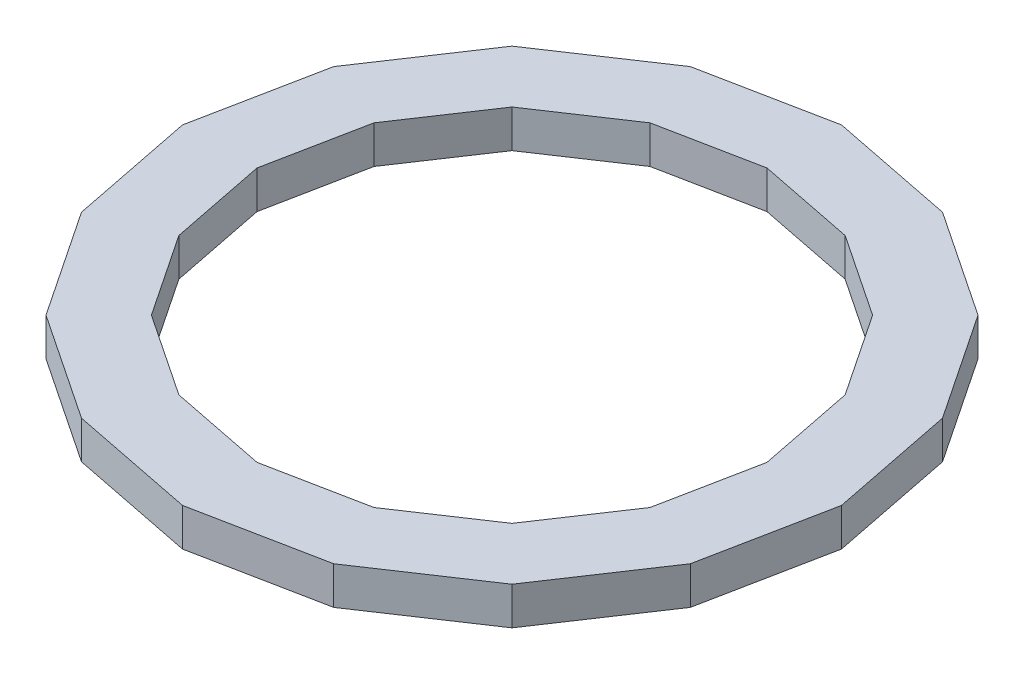
ISO-10303-21;
HEADER;
FILE_DESCRIPTION(('STEP AP214'),'2;1');
FILE_NAME('part.step','',(''),(''),'','','');
FILE_SCHEMA(('AUTOMOTIVE_DESIGN { 1 0 10303 214 1 1 1 1 }'));
ENDSEC;
DATA;
#1=APPLICATION_CONTEXT('core data for automotive mechanical design processes');
#2=APPLICATION_PROTOCOL_DEFINITION('international standard','automotive_design',2000,#1);
#3=PRODUCT_CONTEXT('',#1,'mechanical');
#4=PRODUCT('Part','Part','',(#3));
#5=PRODUCT_RELATED_PRODUCT_CATEGORY('part','',(#4));
#6=PRODUCT_DEFINITION_FORMATION('','',#4);
#7=PRODUCT_DEFINITION_CONTEXT('part definition',#1,'design');
#8=PRODUCT_DEFINITION('design','',#6,#7);
#9=PRODUCT_DEFINITION_SHAPE('','',#8);
#10=(LENGTH_UNIT() NAMED_UNIT(*) SI_UNIT(.MILLI.,.METRE.));
#11=(NAMED_UNIT(*) PLANE_ANGLE_UNIT() SI_UNIT($,.RADIAN.));
#12=(NAMED_UNIT(*) SI_UNIT($,.STERADIAN.) SOLID_ANGLE_UNIT());
#13=UNCERTAINTY_MEASURE_WITH_UNIT(LENGTH_MEASURE(1.E-05),#10,'distance_accuracy_value','');
#14=(GEOMETRIC_REPRESENTATION_CONTEXT(3) GLOBAL_UNCERTAINTY_ASSIGNED_CONTEXT((#13)) GLOBAL_UNIT_ASSIGNED_CONTEXT((#10,
#11,#12)) REPRESENTATION_CONTEXT('',''));
#15=CARTESIAN_POINT('',(0.,0.,0.));
#16=DIRECTION('',(0.,0.,1.));
#17=DIRECTION('',(1.,0.,0.));
#18=AXIS2_PLACEMENT_3D('',#15,#16,#17);
#19=CARTESIAN_POINT('',(0.,19.05,0.));
#20=DIRECTION('',(0.,1.,0.));
#21=DIRECTION('',(0.,0.,1.));
#22=AXIS2_PLACEMENT_3D('',#19,#20,#21);
#23=PLANE('',#22);
#24=DIRECTION('',(0.195090322016117,0.,-0.980785280403232));
#25=VECTOR('',#24,1.);
#26=CARTESIAN_POINT('',(153.364033393234,19.05,63.5254626117156));
#27=LINE('',#26,#25);
#28=CARTESIAN_POINT('',(153.364033393234,19.05,63.5254626117156));
#29=VERTEX_POINT('',#28);
#30=CARTESIAN_POINT('',(166.000033550218,19.05,-1.88043767974877E-12));
#31=VERTEX_POINT('',#30);
#32=EDGE_CURVE('E376',#29,#31,#27,.T.);
#33=ORIENTED_EDGE('',*,*,#32,.T.);
#34=DIRECTION('',(-0.195090322016139,0.,-0.980785280403228));
#35=VECTOR('',#34,1.);
#36=CARTESIAN_POINT('',(166.000033550218,19.05,-1.88043767974877E-12));
#37=LINE('',#36,#35);
#38=CARTESIAN_POINT('',(153.364033393232,19.05,-63.525462611719));
#39=VERTEX_POINT('',#38);
#40=EDGE_CURVE('E379',#31,#39,#37,.T.);
#41=ORIENTED_EDGE('',*,*,#40,.T.);
#42=DIRECTION('',(-0.555570233019612,0.,-0.831469612302539));
#43=VECTOR('',#42,1.);
#44=CARTESIAN_POINT('',(153.364033393232,19.05,-63.525462611719));
#45=LINE('',#44,#43);
#46=CARTESIAN_POINT('',(117.379749400552,19.05,-117.379749400555));
#47=VERTEX_POINT('',#46);
#48=EDGE_CURVE('E382',#39,#47,#45,.T.);
#49=ORIENTED_EDGE('',*,*,#48,.T.);
#50=DIRECTION('',(-0.831469612302552,0.,-0.555570233019593));
#51=VECTOR('',#50,1.);
#52=CARTESIAN_POINT('',(117.379749400552,19.05,-117.379749400555));
#53=LINE('',#52,#51);
#54=CARTESIAN_POINT('',(63.5254626117155,19.05,-153.364033393234));
#55=VERTEX_POINT('',#54);
#56=EDGE_CURVE('E384',#47,#55,#53,.T.);
#57=ORIENTED_EDGE('',*,*,#56,.T.);
#58=DIRECTION('',(-0.980785280403233,0.,-0.195090322016117));
#59=VECTOR('',#58,1.);
#60=CARTESIAN_POINT('',(63.5254626117155,19.05,-153.364033393234));
#61=LINE('',#60,#59);
#62=CARTESIAN_POINT('',(-1.84523788441443E-12,19.05,-166.000033550217));
#63=VERTEX_POINT('',#62);
#64=EDGE_CURVE('E386',#55,#63,#61,.T.);
#65=ORIENTED_EDGE('',*,*,#64,.T.);
#66=DIRECTION('',(-0.980785280403228,0.,0.195090322016139));
#67=VECTOR('',#66,1.);
#68=CARTESIAN_POINT('',(-1.84523788441443E-12,19.05,-166.000033550217));
#69=LINE('',#68,#67);
#70=CARTESIAN_POINT('',(-63.5254626117191,19.05,-153.364033393232));
#71=VERTEX_POINT('',#70);
#72=EDGE_CURVE('E388',#63,#71,#69,.T.);
#73=ORIENTED_EDGE('',*,*,#72,.T.);
#74=DIRECTION('',(-0.831469612302539,0.,0.555570233019612));
#75=VECTOR('',#74,1.);
#76=CARTESIAN_POINT('',(-63.5254626117191,19.05,-153.364033393232));
#77=LINE('',#76,#75);
#78=CARTESIAN_POINT('',(-117.379749400555,19.05,-117.379749400552));
#79=VERTEX_POINT('',#78);
#80=EDGE_CURVE('E390',#71,#79,#77,.T.);
#81=ORIENTED_EDGE('',*,*,#80,.T.);
#82=DIRECTION('',(-0.555570233019593,0.,0.831469612302552));
#83=VECTOR('',#82,1.);
#84=CARTESIAN_POINT('',(-117.379749400555,19.05,-117.379749400552));
#85=LINE('',#84,#83);
#86=CARTESIAN_POINT('',(-153.364033393234,19.05,-63.5254626117156));
#87=VERTEX_POINT('',#86);
#88=EDGE_CURVE('E392',#79,#87,#85,.T.);
#89=ORIENTED_EDGE('',*,*,#88,.T.);
#90=DIRECTION('',(-0.195090322016117,0.,0.980785280403233));
#91=VECTOR('',#90,1.);
#92=CARTESIAN_POINT('',(-153.364033393234,19.05,-63.5254626117156));
#93=LINE('',#92,#91);
#94=CARTESIAN_POINT('',(-166.000033550217,19.05,1.88176178542679E-12));
#95=VERTEX_POINT('',#94);
#96=EDGE_CURVE('E395',#87,#95,#93,.T.);
#97=ORIENTED_EDGE('',*,*,#96,.T.);
#98=DIRECTION('',(0.195090322016139,0.,0.980785280403228));
#99=VECTOR('',#98,1.);
#100=CARTESIAN_POINT('',(-166.000033550217,19.05,1.88176178542679E-12));
#101=LINE('',#100,#99);
#102=CARTESIAN_POINT('',(-153.364033393232,19.05,63.5254626117191));
#103=VERTEX_POINT('',#102);
#104=EDGE_CURVE('E397',#95,#103,#101,.T.);
#105=ORIENTED_EDGE('',*,*,#104,.T.);
#106=DIRECTION('',(0.555570233019612,0.,0.831469612302539));
#107=VECTOR('',#106,1.);
#108=CARTESIAN_POINT('',(-153.364033393232,19.05,63.5254626117191));
#109=LINE('',#108,#107);
#110=CARTESIAN_POINT('',(-117.379749400552,19.05,117.379749400555));
#111=VERTEX_POINT('',#110);
#112=EDGE_CURVE('E400',#103,#111,#109,.T.);
#113=ORIENTED_EDGE('',*,*,#112,.T.);
#114=DIRECTION('',(0.831469612302552,0.,0.555570233019593));
#115=VECTOR('',#114,1.);
#116=CARTESIAN_POINT('',(-117.379749400552,19.05,117.379749400555));
#117=LINE('',#116,#115);
#118=CARTESIAN_POINT('',(-63.5254626117156,19.05,153.364033393234));
#119=VERTEX_POINT('',#118);
#120=EDGE_CURVE('E403',#111,#119,#117,.T.);
#121=ORIENTED_EDGE('',*,*,#120,.T.);
#122=DIRECTION('',(0.980785280403233,0.,0.195090322016118));
#123=VECTOR('',#122,1.);
#124=CARTESIAN_POINT('',(-63.5254626117156,19.05,153.364033393234));
#125=LINE('',#124,#123);
#126=CARTESIAN_POINT('',(1.90230677502918E-12,19.05,166.000033550218));
#127=VERTEX_POINT('',#126);
#128=EDGE_CURVE('E406',#119,#127,#125,.T.);
#129=ORIENTED_EDGE('',*,*,#128,.T.);
#130=DIRECTION('',(0.980785280403228,0.,-0.195090322016139));
#131=VECTOR('',#130,1.);
#132=CARTESIAN_POINT('',(1.90230677502918E-12,19.05,166.000033550218));
#133=LINE('',#132,#131);
#134=CARTESIAN_POINT('',(63.525462611719,19.05,153.364033393232));
#135=VERTEX_POINT('',#134);
#136=EDGE_CURVE('E408',#127,#135,#133,.T.);
#137=ORIENTED_EDGE('',*,*,#136,.T.);
#138=DIRECTION('',(0.831469612302539,0.,-0.555570233019612));
#139=VECTOR('',#138,1.);
#140=CARTESIAN_POINT('',(63.525462611719,19.05,153.364033393232));
#141=LINE('',#140,#139);
#142=CARTESIAN_POINT('',(117.379749400555,19.05,117.379749400552));
#143=VERTEX_POINT('',#142);
#144=EDGE_CURVE('E411',#135,#143,#141,.T.);
#145=ORIENTED_EDGE('',*,*,#144,.T.);
#146=DIRECTION('',(0.555570233019593,0.,-0.831469612302551));
#147=VECTOR('',#146,1.);
#148=CARTESIAN_POINT('',(117.379749400555,19.05,117.379749400552));
#149=LINE('',#148,#147);
#150=EDGE_CURVE('E414',#143,#29,#149,.T.);
#151=ORIENTED_EDGE('',*,*,#150,.T.);
#152=EDGE_LOOP('',(#33,#41,#49,#57,#65,#73,#81,#89,#97,#105,#113,#121,#129,#137,#145,#151));
#153=FACE_BOUND('',#152,.T.);
#154=DIRECTION('',(-0.195090322016139,0.,-0.980785280403228));
#155=VECTOR('',#154,1.);
#156=CARTESIAN_POINT('',(128.448491193405,19.05,-1.48468068421396E-12));
#157=LINE('',#156,#155);
#158=CARTESIAN_POINT('',(128.448491193405,19.05,-1.48468068421396E-12));
#159=VERTEX_POINT('',#158);
#160=CARTESIAN_POINT('',(118.670931995543,19.05,-49.1551094920106));
#161=VERTEX_POINT('',#160);
#162=EDGE_CURVE('E253',#159,#161,#157,.T.);
#163=ORIENTED_EDGE('',*,*,#162,.F.);
#164=DIRECTION('',(0.195090322016117,0.,-0.980785280403233));
#165=VECTOR('',#164,1.);
#166=CARTESIAN_POINT('',(118.670931995544,19.05,49.155109492008));
#167=LINE('',#166,#165);
#168=CARTESIAN_POINT('',(118.670931995544,19.05,49.155109492008));
#169=VERTEX_POINT('',#168);
#170=EDGE_CURVE('E244',#169,#159,#167,.T.);
#171=ORIENTED_EDGE('',*,*,#170,.F.);
#172=DIRECTION('',(0.555570233019593,0.,-0.831469612302552));
#173=VECTOR('',#172,1.);
#174=CARTESIAN_POINT('',(90.8267991560384,19.05,90.8267991560363));
#175=LINE('',#174,#173);
#176=CARTESIAN_POINT('',(90.8267991560384,19.05,90.8267991560363));
#177=VERTEX_POINT('',#176);
#178=EDGE_CURVE('E298',#177,#169,#175,.T.);
#179=ORIENTED_EDGE('',*,*,#178,.F.);
#180=DIRECTION('',(0.831469612302539,0.,-0.555570233019612));
#181=VECTOR('',#180,1.);
#182=CARTESIAN_POINT('',(49.1551094920106,19.05,118.670931995543));
#183=LINE('',#182,#181);
#184=CARTESIAN_POINT('',(49.1551094920106,19.05,118.670931995543));
#185=VERTEX_POINT('',#184);
#186=EDGE_CURVE('E295',#185,#177,#183,.T.);
#187=ORIENTED_EDGE('',*,*,#186,.F.);
#188=DIRECTION('',(0.980785280403228,0.,-0.195090322016139));
#189=VECTOR('',#188,1.);
#190=CARTESIAN_POINT('',(1.41474604052981E-12,19.05,128.448491193405));
#191=LINE('',#190,#189);
#192=CARTESIAN_POINT('',(1.41474604052981E-12,19.05,128.448491193405));
#193=VERTEX_POINT('',#192);
#194=EDGE_CURVE('E293',#193,#185,#191,.T.);
#195=ORIENTED_EDGE('',*,*,#194,.F.);
#196=DIRECTION('',(0.980785280403233,0.,0.195090322016117));
#197=VECTOR('',#196,1.);
#198=CARTESIAN_POINT('',(-49.155109492008,19.05,118.670931995544));
#199=LINE('',#198,#197);
#200=CARTESIAN_POINT('',(-49.155109492008,19.05,118.670931995544));
#201=VERTEX_POINT('',#200);
#202=EDGE_CURVE('E291',#201,#193,#199,.T.);
#203=ORIENTED_EDGE('',*,*,#202,.F.);
#204=DIRECTION('',(0.831469612302552,0.,0.555570233019593));
#205=VECTOR('',#204,1.);
#206=CARTESIAN_POINT('',(-90.8267991560363,19.05,90.8267991560384));
#207=LINE('',#206,#205);
#208=CARTESIAN_POINT('',(-90.8267991560363,19.05,90.8267991560384));
#209=VERTEX_POINT('',#208);
#210=EDGE_CURVE('E289',#209,#201,#207,.T.);
#211=ORIENTED_EDGE('',*,*,#210,.F.);
#212=DIRECTION('',(0.555570233019612,0.,0.831469612302539));
#213=VECTOR('',#212,1.);
#214=CARTESIAN_POINT('',(-118.670931995543,19.05,49.1551094920107));
#215=LINE('',#214,#213);
#216=CARTESIAN_POINT('',(-118.670931995543,19.05,49.1551094920107));
#217=VERTEX_POINT('',#216);
#218=EDGE_CURVE('E286',#217,#209,#215,.T.);
#219=ORIENTED_EDGE('',*,*,#218,.F.);
#220=DIRECTION('',(0.195090322016139,0.,0.980785280403228));
#221=VECTOR('',#220,1.);
#222=CARTESIAN_POINT('',(-128.448491193405,19.05,1.44299007696502E-12));
#223=LINE('',#222,#221);
#224=CARTESIAN_POINT('',(-128.448491193405,19.05,1.44299007696502E-12));
#225=VERTEX_POINT('',#224);
#226=EDGE_CURVE('E284',#225,#217,#223,.T.);
#227=ORIENTED_EDGE('',*,*,#226,.F.);
#228=DIRECTION('',(-0.195090322016117,0.,0.980785280403233));
#229=VECTOR('',#228,1.);
#230=CARTESIAN_POINT('',(-118.670931995544,19.05,-49.1551094920079));
#231=LINE('',#230,#229);
#232=CARTESIAN_POINT('',(-118.670931995544,19.05,-49.1551094920079));
#233=VERTEX_POINT('',#232);
#234=EDGE_CURVE('E281',#233,#225,#231,.T.);
#235=ORIENTED_EDGE('',*,*,#234,.F.);
#236=DIRECTION('',(-0.555570233019593,0.,0.831469612302551));
#237=VECTOR('',#236,1.);
#238=CARTESIAN_POINT('',(-90.8267991560383,19.05,-90.8267991560363));
#239=LINE('',#238,#237);
#240=CARTESIAN_POINT('',(-90.8267991560383,19.05,-90.8267991560363));
#241=VERTEX_POINT('',#240);
#242=EDGE_CURVE('E278',#241,#233,#239,.T.);
#243=ORIENTED_EDGE('',*,*,#242,.F.);
#244=DIRECTION('',(-0.831469612302539,0.,0.555570233019612));
#245=VECTOR('',#244,1.);
#246=CARTESIAN_POINT('',(-49.1551094920107,19.05,-118.670931995543));
#247=LINE('',#246,#245);
#248=CARTESIAN_POINT('',(-49.1551094920107,19.05,-118.670931995543));
#249=VERTEX_POINT('',#248);
#250=EDGE_CURVE('E276',#249,#241,#247,.T.);
#251=ORIENTED_EDGE('',*,*,#250,.F.);
#252=DIRECTION('',(-0.980785280403228,0.,0.19509032201614));
#253=VECTOR('',#252,1.);
#254=CARTESIAN_POINT('',(-1.41525569572921E-12,19.05,-128.448491193405));
#255=LINE('',#254,#253);
#256=CARTESIAN_POINT('',(-1.41525569572921E-12,19.05,-128.448491193405));
#257=VERTEX_POINT('',#256);
#258=EDGE_CURVE('E274',#257,#249,#255,.T.);
#259=ORIENTED_EDGE('',*,*,#258,.F.);
#260=DIRECTION('',(-0.980785280403233,0.,-0.195090322016117));
#261=VECTOR('',#260,1.);
#262=CARTESIAN_POINT('',(49.1551094920079,19.05,-118.670931995544));
#263=LINE('',#262,#261);
#264=CARTESIAN_POINT('',(49.1551094920079,19.05,-118.670931995544));
#265=VERTEX_POINT('',#264);
#266=EDGE_CURVE('E272',#265,#257,#263,.T.);
#267=ORIENTED_EDGE('',*,*,#266,.F.);
#268=DIRECTION('',(-0.831469612302552,0.,-0.555570233019593));
#269=VECTOR('',#268,1.);
#270=CARTESIAN_POINT('',(90.8267991560363,19.05,-90.8267991560384));
#271=LINE('',#270,#269);
#272=CARTESIAN_POINT('',(90.8267991560363,19.05,-90.8267991560384));
#273=VERTEX_POINT('',#272);
#274=EDGE_CURVE('E268',#273,#265,#271,.T.);
#275=ORIENTED_EDGE('',*,*,#274,.F.);
#276=DIRECTION('',(-0.555570233019612,0.,-0.831469612302539));
#277=VECTOR('',#276,1.);
#278=CARTESIAN_POINT('',(118.670931995543,19.05,-49.1551094920106));
#279=LINE('',#278,#277);
#280=EDGE_CURVE('E266',#161,#273,#279,.T.);
#281=ORIENTED_EDGE('',*,*,#280,.F.);
#282=EDGE_LOOP('',(#163,#171,#179,#187,#195,#203,#211,#219,#227,#235,#243,#251,#259,#267,#275,#281));
#283=FACE_BOUND('',#282,.T.);
#284=ADVANCED_FACE('F35',(#153,#283),#23,.T.);
#285=CARTESIAN_POINT('',(0.,0.,0.));
#286=DIRECTION('',(0.,1.,0.));
#287=DIRECTION('',(0.,0.,1.));
#288=AXIS2_PLACEMENT_3D('',#285,#286,#287);
#289=PLANE('',#288);
#290=DIRECTION('',(0.195090322016117,0.,-0.980785280403232));
#291=VECTOR('',#290,1.);
#292=CARTESIAN_POINT('',(153.364033393234,0.,63.5254626117156));
#293=LINE('',#292,#291);
#294=CARTESIAN_POINT('',(153.364033393234,0.,63.5254626117156));
#295=VERTEX_POINT('',#294);
#296=CARTESIAN_POINT('',(166.000033550218,0.,-1.88043767974877E-12));
#297=VERTEX_POINT('',#296);
#298=EDGE_CURVE('E261',#295,#297,#293,.T.);
#299=ORIENTED_EDGE('',*,*,#298,.F.);
#300=DIRECTION('',(0.555570233019593,0.,-0.831469612302551));
#301=VECTOR('',#300,1.);
#302=CARTESIAN_POINT('',(117.379749400555,0.,117.379749400552));
#303=LINE('',#302,#301);
#304=CARTESIAN_POINT('',(117.379749400555,0.,117.379749400552));
#305=VERTEX_POINT('',#304);
#306=EDGE_CURVE('E380',#305,#295,#303,.T.);
#307=ORIENTED_EDGE('',*,*,#306,.F.);
#308=DIRECTION('',(0.831469612302539,0.,-0.555570233019612));
#309=VECTOR('',#308,1.);
#310=CARTESIAN_POINT('',(63.525462611719,0.,153.364033393232));
#311=LINE('',#310,#309);
#312=CARTESIAN_POINT('',(63.525462611719,0.,153.364033393232));
#313=VERTEX_POINT('',#312);
#314=EDGE_CURVE('E451',#313,#305,#311,.T.);
#315=ORIENTED_EDGE('',*,*,#314,.F.);
#316=DIRECTION('',(0.980785280403228,0.,-0.195090322016139));
#317=VECTOR('',#316,1.);
#318=CARTESIAN_POINT('',(1.90230677502918E-12,0.,166.000033550218));
#319=LINE('',#318,#317);
#320=CARTESIAN_POINT('',(1.90230677502918E-12,0.,166.000033550218));
#321=VERTEX_POINT('',#320);
#322=EDGE_CURVE('E448',#321,#313,#319,.T.);
#323=ORIENTED_EDGE('',*,*,#322,.F.);
#324=DIRECTION('',(0.980785280403233,0.,0.195090322016118));
#325=VECTOR('',#324,1.);
#326=CARTESIAN_POINT('',(-63.5254626117156,0.,153.364033393234));
#327=LINE('',#326,#325);
#328=CARTESIAN_POINT('',(-63.5254626117156,0.,153.364033393234));
#329=VERTEX_POINT('',#328);
#330=EDGE_CURVE('E445',#329,#321,#327,.T.);
#331=ORIENTED_EDGE('',*,*,#330,.F.);
#332=DIRECTION('',(0.831469612302552,0.,0.555570233019593));
#333=VECTOR('',#332,1.);
#334=CARTESIAN_POINT('',(-117.379749400552,0.,117.379749400555));
#335=LINE('',#334,#333);
#336=CARTESIAN_POINT('',(-117.379749400552,0.,117.379749400555));
#337=VERTEX_POINT('',#336);
#338=EDGE_CURVE('E442',#337,#329,#335,.T.);
#339=ORIENTED_EDGE('',*,*,#338,.F.);
#340=DIRECTION('',(0.555570233019612,0.,0.831469612302539));
#341=VECTOR('',#340,1.);
#342=CARTESIAN_POINT('',(-153.364033393232,0.,63.5254626117191));
#343=LINE('',#342,#341);
#344=CARTESIAN_POINT('',(-153.364033393232,0.,63.5254626117191));
#345=VERTEX_POINT('',#344);
#346=EDGE_CURVE('E439',#345,#337,#343,.T.);
#347=ORIENTED_EDGE('',*,*,#346,.F.);
#348=DIRECTION('',(0.195090322016139,0.,0.980785280403228));
#349=VECTOR('',#348,1.);
#350=CARTESIAN_POINT('',(-166.000033550217,0.,1.88176178542679E-12));
#351=LINE('',#350,#349);
#352=CARTESIAN_POINT('',(-166.000033550217,0.,1.88176178542679E-12));
#353=VERTEX_POINT('',#352);
#354=EDGE_CURVE('E436',#353,#345,#351,.T.);
#355=ORIENTED_EDGE('',*,*,#354,.F.);
#356=DIRECTION('',(-0.195090322016117,0.,0.980785280403233));
#357=VECTOR('',#356,1.);
#358=CARTESIAN_POINT('',(-153.364033393234,0.,-63.5254626117156));
#359=LINE('',#358,#357);
#360=CARTESIAN_POINT('',(-153.364033393234,0.,-63.5254626117156));
#361=VERTEX_POINT('',#360);
#362=EDGE_CURVE('E433',#361,#353,#359,.T.);
#363=ORIENTED_EDGE('',*,*,#362,.F.);
#364=DIRECTION('',(-0.555570233019593,0.,0.831469612302552));
#365=VECTOR('',#364,1.);
#366=CARTESIAN_POINT('',(-117.379749400555,0.,-117.379749400552));
#367=LINE('',#366,#365);
#368=CARTESIAN_POINT('',(-117.379749400555,0.,-117.379749400552));
#369=VERTEX_POINT('',#368);
#370=EDGE_CURVE('E431',#369,#361,#367,.T.);
#371=ORIENTED_EDGE('',*,*,#370,.F.);
#372=DIRECTION('',(-0.831469612302539,0.,0.555570233019612));
#373=VECTOR('',#372,1.);
#374=CARTESIAN_POINT('',(-63.5254626117191,0.,-153.364033393232));
#375=LINE('',#374,#373);
#376=CARTESIAN_POINT('',(-63.5254626117191,0.,-153.364033393232));
#377=VERTEX_POINT('',#376);
#378=EDGE_CURVE('E429',#377,#369,#375,.T.);
#379=ORIENTED_EDGE('',*,*,#378,.F.);
#380=DIRECTION('',(-0.980785280403228,0.,0.195090322016139));
#381=VECTOR('',#380,1.);
#382=CARTESIAN_POINT('',(-1.84523788441443E-12,0.,-166.000033550217));
#383=LINE('',#382,#381);
#384=CARTESIAN_POINT('',(-1.84523788441443E-12,0.,-166.000033550217));
#385=VERTEX_POINT('',#384);
#386=EDGE_CURVE('E427',#385,#377,#383,.T.);
#387=ORIENTED_EDGE('',*,*,#386,.F.);
#388=DIRECTION('',(-0.980785280403233,0.,-0.195090322016117));
#389=VECTOR('',#388,1.);
#390=CARTESIAN_POINT('',(63.5254626117155,0.,-153.364033393234));
#391=LINE('',#390,#389);
#392=CARTESIAN_POINT('',(63.5254626117155,0.,-153.364033393234));
#393=VERTEX_POINT('',#392);
#394=EDGE_CURVE('E425',#393,#385,#391,.T.);
#395=ORIENTED_EDGE('',*,*,#394,.F.);
#396=DIRECTION('',(-0.831469612302552,0.,-0.555570233019593));
#397=VECTOR('',#396,1.);
#398=CARTESIAN_POINT('',(117.379749400552,0.,-117.379749400555));
#399=LINE('',#398,#397);
#400=CARTESIAN_POINT('',(117.379749400552,0.,-117.379749400555));
#401=VERTEX_POINT('',#400);
#402=EDGE_CURVE('E423',#401,#393,#399,.T.);
#403=ORIENTED_EDGE('',*,*,#402,.F.);
#404=DIRECTION('',(-0.555570233019612,0.,-0.831469612302539));
#405=VECTOR('',#404,1.);
#406=CARTESIAN_POINT('',(153.364033393232,0.,-63.525462611719));
#407=LINE('',#406,#405);
#408=CARTESIAN_POINT('',(153.364033393232,0.,-63.525462611719));
#409=VERTEX_POINT('',#408);
#410=EDGE_CURVE('E421',#409,#401,#407,.T.);
#411=ORIENTED_EDGE('',*,*,#410,.F.);
#412=DIRECTION('',(-0.195090322016139,0.,-0.980785280403228));
#413=VECTOR('',#412,1.);
#414=CARTESIAN_POINT('',(166.000033550218,0.,-1.88043767974877E-12));
#415=LINE('',#414,#413);
#416=EDGE_CURVE('E419',#297,#409,#415,.T.);
#417=ORIENTED_EDGE('',*,*,#416,.F.);
#418=EDGE_LOOP('',(#299,#307,#315,#323,#331,#339,#347,#355,#363,#371,#379,#387,#395,#403,#411,#417));
#419=FACE_BOUND('',#418,.T.);
#420=DIRECTION('',(0.195090322016117,0.,-0.980785280403233));
#421=VECTOR('',#420,1.);
#422=CARTESIAN_POINT('',(118.670931995544,0.,49.155109492008));
#423=LINE('',#422,#421);
#424=CARTESIAN_POINT('',(118.670931995544,0.,49.155109492008));
#425=VERTEX_POINT('',#424);
#426=CARTESIAN_POINT('',(128.448491193405,0.,-1.48468068421396E-12));
#427=VERTEX_POINT('',#426);
#428=EDGE_CURVE('E58',#425,#427,#423,.T.);
#429=ORIENTED_EDGE('',*,*,#428,.T.);
#430=DIRECTION('',(-0.195090322016139,0.,-0.980785280403228));
#431=VECTOR('',#430,1.);
#432=CARTESIAN_POINT('',(128.448491193405,0.,-1.48468068421396E-12));
#433=LINE('',#432,#431);
#434=CARTESIAN_POINT('',(118.670931995543,0.,-49.1551094920106));
#435=VERTEX_POINT('',#434);
#436=EDGE_CURVE('E260',#427,#435,#433,.T.);
#437=ORIENTED_EDGE('',*,*,#436,.T.);
#438=DIRECTION('',(-0.555570233019612,0.,-0.831469612302539));
#439=VECTOR('',#438,1.);
#440=CARTESIAN_POINT('',(118.670931995543,0.,-49.1551094920106));
#441=LINE('',#440,#439);
#442=CARTESIAN_POINT('',(90.8267991560363,0.,-90.8267991560384));
#443=VERTEX_POINT('',#442);
#444=EDGE_CURVE('E302',#435,#443,#441,.T.);
#445=ORIENTED_EDGE('',*,*,#444,.T.);
#446=DIRECTION('',(-0.831469612302552,0.,-0.555570233019593));
#447=VECTOR('',#446,1.);
#448=CARTESIAN_POINT('',(90.8267991560363,0.,-90.8267991560384));
#449=LINE('',#448,#447);
#450=CARTESIAN_POINT('',(49.1551094920079,0.,-118.670931995544));
#451=VERTEX_POINT('',#450);
#452=EDGE_CURVE('E305',#443,#451,#449,.T.);
#453=ORIENTED_EDGE('',*,*,#452,.T.);
#454=DIRECTION('',(-0.980785280403233,0.,-0.195090322016117));
#455=VECTOR('',#454,1.);
#456=CARTESIAN_POINT('',(49.1551094920079,0.,-118.670931995544));
#457=LINE('',#456,#455);
#458=CARTESIAN_POINT('',(-1.41525569572921E-12,0.,-128.448491193405));
#459=VERTEX_POINT('',#458);
#460=EDGE_CURVE('E308',#451,#459,#457,.T.);
#461=ORIENTED_EDGE('',*,*,#460,.T.);
#462=DIRECTION('',(-0.980785280403228,0.,0.19509032201614));
#463=VECTOR('',#462,1.);
#464=CARTESIAN_POINT('',(-1.41525569572921E-12,0.,-128.448491193405));
#465=LINE('',#464,#463);
#466=CARTESIAN_POINT('',(-49.1551094920107,0.,-118.670931995543));
#467=VERTEX_POINT('',#466);
#468=EDGE_CURVE('E311',#459,#467,#465,.T.);
#469=ORIENTED_EDGE('',*,*,#468,.T.);
#470=DIRECTION('',(-0.831469612302539,0.,0.555570233019612));
#471=VECTOR('',#470,1.);
#472=CARTESIAN_POINT('',(-49.1551094920107,0.,-118.670931995543));
#473=LINE('',#472,#471);
#474=CARTESIAN_POINT('',(-90.8267991560383,0.,-90.8267991560363));
#475=VERTEX_POINT('',#474);
#476=EDGE_CURVE('E314',#467,#475,#473,.T.);
#477=ORIENTED_EDGE('',*,*,#476,.T.);
#478=DIRECTION('',(-0.555570233019593,0.,0.831469612302551));
#479=VECTOR('',#478,1.);
#480=CARTESIAN_POINT('',(-90.8267991560383,0.,-90.8267991560363));
#481=LINE('',#480,#479);
#482=CARTESIAN_POINT('',(-118.670931995544,0.,-49.1551094920079));
#483=VERTEX_POINT('',#482);
#484=EDGE_CURVE('E317',#475,#483,#481,.T.);
#485=ORIENTED_EDGE('',*,*,#484,.T.);
#486=DIRECTION('',(-0.195090322016117,0.,0.980785280403233));
#487=VECTOR('',#486,1.);
#488=CARTESIAN_POINT('',(-118.670931995544,0.,-49.1551094920079));
#489=LINE('',#488,#487);
#490=CARTESIAN_POINT('',(-128.448491193405,0.,1.44299007696502E-12));
#491=VERTEX_POINT('',#490);
#492=EDGE_CURVE('E320',#483,#491,#489,.T.);
#493=ORIENTED_EDGE('',*,*,#492,.T.);
#494=DIRECTION('',(0.195090322016139,0.,0.980785280403228));
#495=VECTOR('',#494,1.);
#496=CARTESIAN_POINT('',(-128.448491193405,0.,1.44299007696502E-12));
#497=LINE('',#496,#495);
#498=CARTESIAN_POINT('',(-118.670931995543,0.,49.1551094920107));
#499=VERTEX_POINT('',#498);
#500=EDGE_CURVE('E324',#491,#499,#497,.T.);
#501=ORIENTED_EDGE('',*,*,#500,.T.);
#502=DIRECTION('',(0.555570233019612,0.,0.831469612302539));
#503=VECTOR('',#502,1.);
#504=CARTESIAN_POINT('',(-118.670931995543,0.,49.1551094920107));
#505=LINE('',#504,#503);
#506=CARTESIAN_POINT('',(-90.8267991560363,0.,90.8267991560384));
#507=VERTEX_POINT('',#506);
#508=EDGE_CURVE('E327',#499,#507,#505,.T.);
#509=ORIENTED_EDGE('',*,*,#508,.T.);
#510=DIRECTION('',(0.831469612302552,0.,0.555570233019593));
#511=VECTOR('',#510,1.);
#512=CARTESIAN_POINT('',(-90.8267991560363,0.,90.8267991560384));
#513=LINE('',#512,#511);
#514=CARTESIAN_POINT('',(-49.155109492008,0.,118.670931995544));
#515=VERTEX_POINT('',#514);
#516=EDGE_CURVE('E330',#507,#515,#513,.T.);
#517=ORIENTED_EDGE('',*,*,#516,.T.);
#518=DIRECTION('',(0.980785280403233,0.,0.195090322016117));
#519=VECTOR('',#518,1.);
#520=CARTESIAN_POINT('',(-49.155109492008,0.,118.670931995544));
#521=LINE('',#520,#519);
#522=CARTESIAN_POINT('',(1.41474604052981E-12,0.,128.448491193405));
#523=VERTEX_POINT('',#522);
#524=EDGE_CURVE('E333',#515,#523,#521,.T.);
#525=ORIENTED_EDGE('',*,*,#524,.T.);
#526=DIRECTION('',(0.980785280403228,0.,-0.195090322016139));
#527=VECTOR('',#526,1.);
#528=CARTESIAN_POINT('',(1.41474604052981E-12,0.,128.448491193405));
#529=LINE('',#528,#527);
#530=CARTESIAN_POINT('',(49.1551094920106,0.,118.670931995543));
#531=VERTEX_POINT('',#530);
#532=EDGE_CURVE('E336',#523,#531,#529,.T.);
#533=ORIENTED_EDGE('',*,*,#532,.T.);
#534=DIRECTION('',(0.831469612302539,0.,-0.555570233019612));
#535=VECTOR('',#534,1.);
#536=CARTESIAN_POINT('',(49.1551094920106,0.,118.670931995543));
#537=LINE('',#536,#535);
#538=CARTESIAN_POINT('',(90.8267991560384,0.,90.8267991560363));
#539=VERTEX_POINT('',#538);
#540=EDGE_CURVE('E339',#531,#539,#537,.T.);
#541=ORIENTED_EDGE('',*,*,#540,.T.);
#542=DIRECTION('',(0.555570233019593,0.,-0.831469612302552));
#543=VECTOR('',#542,1.);
#544=CARTESIAN_POINT('',(90.8267991560384,0.,90.8267991560363));
#545=LINE('',#544,#543);
#546=EDGE_CURVE('E254',#539,#425,#545,.T.);
#547=ORIENTED_EDGE('',*,*,#546,.T.);
#548=EDGE_LOOP('',(#429,#437,#445,#453,#461,#469,#477,#485,#493,#501,#509,#517,#525,#533,#541,#547));
#549=FACE_BOUND('',#548,.T.);
#550=ADVANCED_FACE('F509',(#419,#549),#289,.F.);
#551=CARTESIAN_POINT('',(153.364033393234,19.05,63.5254626117156));
#552=DIRECTION('',(-0.980785280403233,0.,-0.195090322016117));
#553=DIRECTION('',(-0.195090322016117,0.,0.980785280403233));
#554=AXIS2_PLACEMENT_3D('',#551,#552,#553);
#555=PLANE('',#554);
#556=ORIENTED_EDGE('',*,*,#298,.T.);
#557=DIRECTION('',(0.,-1.,0.));
#558=VECTOR('',#557,1.);
#559=CARTESIAN_POINT('',(166.000033550218,19.05,-1.88043767974877E-12));
#560=LINE('',#559,#558);
#561=EDGE_CURVE('E11',#31,#297,#560,.T.);
#562=ORIENTED_EDGE('',*,*,#561,.F.);
#563=ORIENTED_EDGE('',*,*,#32,.F.);
#564=DIRECTION('',(0.,-1.,0.));
#565=VECTOR('',#564,1.);
#566=CARTESIAN_POINT('',(153.364033393234,19.05,63.5254626117156));
#567=LINE('',#566,#565);
#568=EDGE_CURVE('E416',#29,#295,#567,.T.);
#569=ORIENTED_EDGE('',*,*,#568,.T.);
#570=EDGE_LOOP('',(#556,#562,#563,#569));
#571=FACE_BOUND('',#570,.T.);
#572=ADVANCED_FACE('F37',(#571),#555,.F.);
#573=CARTESIAN_POINT('',(166.000033550218,19.05,-1.88043767974877E-12));
#574=DIRECTION('',(-0.980785280403228,0.,0.195090322016139));
#575=DIRECTION('',(0.195090322016139,0.,0.980785280403228));
#576=AXIS2_PLACEMENT_3D('',#573,#574,#575);
#577=PLANE('',#576);
#578=ORIENTED_EDGE('',*,*,#416,.T.);
#579=DIRECTION('',(0.,-1.,0.));
#580=VECTOR('',#579,1.);
#581=CARTESIAN_POINT('',(153.364033393232,19.05,-63.525462611719));
#582=LINE('',#581,#580);
#583=EDGE_CURVE('E43',#39,#409,#582,.T.);
#584=ORIENTED_EDGE('',*,*,#583,.F.);
#585=ORIENTED_EDGE('',*,*,#40,.F.);
#586=ORIENTED_EDGE('',*,*,#561,.T.);
#587=EDGE_LOOP('',(#578,#584,#585,#586));
#588=FACE_BOUND('',#587,.T.);
#589=ADVANCED_FACE('F526',(#588),#577,.F.);
#590=CARTESIAN_POINT('',(153.364033393232,19.05,-63.525462611719));
#591=DIRECTION('',(-0.831469612302539,0.,0.555570233019612));
#592=DIRECTION('',(0.555570233019612,0.,0.831469612302539));
#593=AXIS2_PLACEMENT_3D('',#590,#591,#592);
#594=PLANE('',#593);
#595=ORIENTED_EDGE('',*,*,#410,.T.);
#596=DIRECTION('',(0.,-1.,0.));
#597=VECTOR('',#596,1.);
#598=CARTESIAN_POINT('',(117.379749400552,19.05,-117.379749400555));
#599=LINE('',#598,#597);
#600=EDGE_CURVE('E496',#47,#401,#599,.T.);
#601=ORIENTED_EDGE('',*,*,#600,.F.);
#602=ORIENTED_EDGE('',*,*,#48,.F.);
#603=ORIENTED_EDGE('',*,*,#583,.T.);
#604=EDGE_LOOP('',(#595,#601,#602,#603));
#605=FACE_BOUND('',#604,.T.);
#606=ADVANCED_FACE('F503',(#605),#594,.F.);
#607=CARTESIAN_POINT('',(117.379749400552,19.05,-117.379749400555));
#608=DIRECTION('',(-0.555570233019593,0.,0.831469612302552));
#609=DIRECTION('',(0.831469612302552,0.,0.555570233019593));
#610=AXIS2_PLACEMENT_3D('',#607,#608,#609);
#611=PLANE('',#610);
#612=ORIENTED_EDGE('',*,*,#402,.T.);
#613=DIRECTION('',(0.,-1.,0.));
#614=VECTOR('',#613,1.);
#615=CARTESIAN_POINT('',(63.5254626117155,19.05,-153.364033393234));
#616=LINE('',#615,#614);
#617=EDGE_CURVE('E492',#55,#393,#616,.T.);
#618=ORIENTED_EDGE('',*,*,#617,.F.);
#619=ORIENTED_EDGE('',*,*,#56,.F.);
#620=ORIENTED_EDGE('',*,*,#600,.T.);
#621=EDGE_LOOP('',(#612,#618,#619,#620));
#622=FACE_BOUND('',#621,.T.);
#623=ADVANCED_FACE('F515',(#622),#611,.F.);
#624=CARTESIAN_POINT('',(63.5254626117155,19.05,-153.364033393234));
#625=DIRECTION('',(-0.195090322016117,0.,0.980785280403233));
#626=DIRECTION('',(0.980785280403233,0.,0.195090322016117));
#627=AXIS2_PLACEMENT_3D('',#624,#625,#626);
#628=PLANE('',#627);
#629=ORIENTED_EDGE('',*,*,#394,.T.);
#630=DIRECTION('',(0.,-1.,0.));
#631=VECTOR('',#630,1.);
#632=CARTESIAN_POINT('',(-1.84523788441443E-12,19.05,-166.000033550217));
#633=LINE('',#632,#631);
#634=EDGE_CURVE('E489',#63,#385,#633,.T.);
#635=ORIENTED_EDGE('',*,*,#634,.F.);
#636=ORIENTED_EDGE('',*,*,#64,.F.);
#637=ORIENTED_EDGE('',*,*,#617,.T.);
#638=EDGE_LOOP('',(#629,#635,#636,#637));
#639=FACE_BOUND('',#638,.T.);
#640=ADVANCED_FACE('F519',(#639),#628,.F.);
#641=CARTESIAN_POINT('',(-1.84523788441443E-12,19.05,-166.000033550217));
#642=DIRECTION('',(0.195090322016139,0.,0.980785280403228));
#643=DIRECTION('',(0.980785280403228,0.,-0.195090322016139));
#644=AXIS2_PLACEMENT_3D('',#641,#642,#643);
#645=PLANE('',#644);
#646=ORIENTED_EDGE('',*,*,#386,.T.);
#647=DIRECTION('',(0.,-1.,0.));
#648=VECTOR('',#647,1.);
#649=CARTESIAN_POINT('',(-63.5254626117191,19.05,-153.364033393232));
#650=LINE('',#649,#648);
#651=EDGE_CURVE('E486',#71,#377,#650,.T.);
#652=ORIENTED_EDGE('',*,*,#651,.F.);
#653=ORIENTED_EDGE('',*,*,#72,.F.);
#654=ORIENTED_EDGE('',*,*,#634,.T.);
#655=EDGE_LOOP('',(#646,#652,#653,#654));
#656=FACE_BOUND('',#655,.T.);
#657=ADVANCED_FACE('F579',(#656),#645,.F.);
#658=CARTESIAN_POINT('',(-63.5254626117191,19.05,-153.364033393232));
#659=DIRECTION('',(0.555570233019612,0.,0.831469612302539));
#660=DIRECTION('',(0.831469612302539,0.,-0.555570233019612));
#661=AXIS2_PLACEMENT_3D('',#658,#659,#660);
#662=PLANE('',#661);
#663=ORIENTED_EDGE('',*,*,#378,.T.);
#664=DIRECTION('',(0.,-1.,0.));
#665=VECTOR('',#664,1.);
#666=CARTESIAN_POINT('',(-117.379749400555,19.05,-117.379749400552));
#667=LINE('',#666,#665);
#668=EDGE_CURVE('E483',#79,#369,#667,.T.);
#669=ORIENTED_EDGE('',*,*,#668,.F.);
#670=ORIENTED_EDGE('',*,*,#80,.F.);
#671=ORIENTED_EDGE('',*,*,#651,.T.);
#672=EDGE_LOOP('',(#663,#669,#670,#671));
#673=FACE_BOUND('',#672,.T.);
#674=ADVANCED_FACE('F576',(#673),#662,.F.);
#675=CARTESIAN_POINT('',(-117.379749400555,19.05,-117.379749400552));
#676=DIRECTION('',(0.831469612302552,0.,0.555570233019593));
#677=DIRECTION('',(0.555570233019593,0.,-0.831469612302552));
#678=AXIS2_PLACEMENT_3D('',#675,#676,#677);
#679=PLANE('',#678);
#680=ORIENTED_EDGE('',*,*,#370,.T.);
#681=DIRECTION('',(0.,-1.,0.));
#682=VECTOR('',#681,1.);
#683=CARTESIAN_POINT('',(-153.364033393234,19.05,-63.5254626117156));
#684=LINE('',#683,#682);
#685=EDGE_CURVE('E480',#87,#361,#684,.T.);
#686=ORIENTED_EDGE('',*,*,#685,.F.);
#687=ORIENTED_EDGE('',*,*,#88,.F.);
#688=ORIENTED_EDGE('',*,*,#668,.T.);
#689=EDGE_LOOP('',(#680,#686,#687,#688));
#690=FACE_BOUND('',#689,.T.);
#691=ADVANCED_FACE('F572',(#690),#679,.F.);
#692=CARTESIAN_POINT('',(-153.364033393234,19.05,-63.5254626117156));
#693=DIRECTION('',(0.980785280403233,0.,0.195090322016117));
#694=DIRECTION('',(0.195090322016117,0.,-0.980785280403233));
#695=AXIS2_PLACEMENT_3D('',#692,#693,#694);
#696=PLANE('',#695);
#697=ORIENTED_EDGE('',*,*,#362,.T.);
#698=DIRECTION('',(0.,-1.,0.));
#699=VECTOR('',#698,1.);
#700=CARTESIAN_POINT('',(-166.000033550217,19.05,1.88176178542679E-12));
#701=LINE('',#700,#699);
#702=EDGE_CURVE('E476',#95,#353,#701,.T.);
#703=ORIENTED_EDGE('',*,*,#702,.F.);
#704=ORIENTED_EDGE('',*,*,#96,.F.);
#705=ORIENTED_EDGE('',*,*,#685,.T.);
#706=EDGE_LOOP('',(#697,#703,#704,#705));
#707=FACE_BOUND('',#706,.T.);
#708=ADVANCED_FACE('F568',(#707),#696,.F.);
#709=CARTESIAN_POINT('',(-166.000033550217,19.05,1.88176178542679E-12));
#710=DIRECTION('',(0.980785280403228,0.,-0.195090322016139));
#711=DIRECTION('',(-0.195090322016139,0.,-0.980785280403228));
#712=AXIS2_PLACEMENT_3D('',#709,#710,#711);
#713=PLANE('',#712);
#714=ORIENTED_EDGE('',*,*,#354,.T.);
#715=DIRECTION('',(0.,-1.,0.));
#716=VECTOR('',#715,1.);
#717=CARTESIAN_POINT('',(-153.364033393232,19.05,63.5254626117191));
#718=LINE('',#717,#716);
#719=EDGE_CURVE('E472',#103,#345,#718,.T.);
#720=ORIENTED_EDGE('',*,*,#719,.F.);
#721=ORIENTED_EDGE('',*,*,#104,.F.);
#722=ORIENTED_EDGE('',*,*,#702,.T.);
#723=EDGE_LOOP('',(#714,#720,#721,#722));
#724=FACE_BOUND('',#723,.T.);
#725=ADVANCED_FACE('F563',(#724),#713,.F.);
#726=CARTESIAN_POINT('',(-153.364033393232,19.05,63.5254626117191));
#727=DIRECTION('',(0.831469612302539,0.,-0.555570233019612));
#728=DIRECTION('',(-0.555570233019612,0.,-0.831469612302539));
#729=AXIS2_PLACEMENT_3D('',#726,#727,#728);
#730=PLANE('',#729);
#731=ORIENTED_EDGE('',*,*,#346,.T.);
#732=DIRECTION('',(0.,-1.,0.));
#733=VECTOR('',#732,1.);
#734=CARTESIAN_POINT('',(-117.379749400552,19.05,117.379749400555));
#735=LINE('',#734,#733);
#736=EDGE_CURVE('E468',#111,#337,#735,.T.);
#737=ORIENTED_EDGE('',*,*,#736,.F.);
#738=ORIENTED_EDGE('',*,*,#112,.F.);
#739=ORIENTED_EDGE('',*,*,#719,.T.);
#740=EDGE_LOOP('',(#731,#737,#738,#739));
#741=FACE_BOUND('',#740,.T.);
#742=ADVANCED_FACE('F557',(#741),#730,.F.);
#743=CARTESIAN_POINT('',(-117.379749400552,19.05,117.379749400555));
#744=DIRECTION('',(0.555570233019593,0.,-0.831469612302552));
#745=DIRECTION('',(-0.831469612302552,0.,-0.555570233019593));
#746=AXIS2_PLACEMENT_3D('',#743,#744,#745);
#747=PLANE('',#746);
#748=ORIENTED_EDGE('',*,*,#338,.T.);
#749=DIRECTION('',(0.,-1.,0.));
#750=VECTOR('',#749,1.);
#751=CARTESIAN_POINT('',(-63.5254626117156,19.05,153.364033393234));
#752=LINE('',#751,#750);
#753=EDGE_CURVE('E465',#119,#329,#752,.T.);
#754=ORIENTED_EDGE('',*,*,#753,.F.);
#755=ORIENTED_EDGE('',*,*,#120,.F.);
#756=ORIENTED_EDGE('',*,*,#736,.T.);
#757=EDGE_LOOP('',(#748,#754,#755,#756));
#758=FACE_BOUND('',#757,.T.);
#759=ADVANCED_FACE('F553',(#758),#747,.F.);
#760=CARTESIAN_POINT('',(-63.5254626117156,19.05,153.364033393234));
#761=DIRECTION('',(0.195090322016118,0.,-0.980785280403233));
#762=DIRECTION('',(-0.980785280403233,0.,-0.195090322016118));
#763=AXIS2_PLACEMENT_3D('',#760,#761,#762);
#764=PLANE('',#763);
#765=ORIENTED_EDGE('',*,*,#330,.T.);
#766=DIRECTION('',(0.,-1.,0.));
#767=VECTOR('',#766,1.);
#768=CARTESIAN_POINT('',(1.90230677502918E-12,19.05,166.000033550218));
#769=LINE('',#768,#767);
#770=EDGE_CURVE('E462',#127,#321,#769,.T.);
#771=ORIENTED_EDGE('',*,*,#770,.F.);
#772=ORIENTED_EDGE('',*,*,#128,.F.);
#773=ORIENTED_EDGE('',*,*,#753,.T.);
#774=EDGE_LOOP('',(#765,#771,#772,#773));
#775=FACE_BOUND('',#774,.T.);
#776=ADVANCED_FACE('F548',(#775),#764,.F.);
#777=CARTESIAN_POINT('',(1.90230677502918E-12,19.05,166.000033550218));
#778=DIRECTION('',(-0.195090322016139,0.,-0.980785280403228));
#779=DIRECTION('',(-0.980785280403228,0.,0.195090322016139));
#780=AXIS2_PLACEMENT_3D('',#777,#778,#779);
#781=PLANE('',#780);
#782=ORIENTED_EDGE('',*,*,#322,.T.);
#783=DIRECTION('',(0.,-1.,0.));
#784=VECTOR('',#783,1.);
#785=CARTESIAN_POINT('',(63.525462611719,19.05,153.364033393232));
#786=LINE('',#785,#784);
#787=EDGE_CURVE('E459',#135,#313,#786,.T.);
#788=ORIENTED_EDGE('',*,*,#787,.F.);
#789=ORIENTED_EDGE('',*,*,#136,.F.);
#790=ORIENTED_EDGE('',*,*,#770,.T.);
#791=EDGE_LOOP('',(#782,#788,#789,#790));
#792=FACE_BOUND('',#791,.T.);
#793=ADVANCED_FACE('F542',(#792),#781,.F.);
#794=CARTESIAN_POINT('',(63.525462611719,19.05,153.364033393232));
#795=DIRECTION('',(-0.555570233019612,0.,-0.831469612302539));
#796=DIRECTION('',(-0.831469612302539,0.,0.555570233019612));
#797=AXIS2_PLACEMENT_3D('',#794,#795,#796);
#798=PLANE('',#797);
#799=ORIENTED_EDGE('',*,*,#314,.T.);
#800=DIRECTION('',(0.,-1.,0.));
#801=VECTOR('',#800,1.);
#802=CARTESIAN_POINT('',(117.379749400555,19.05,117.379749400552));
#803=LINE('',#802,#801);
#804=EDGE_CURVE('E456',#143,#305,#803,.T.);
#805=ORIENTED_EDGE('',*,*,#804,.F.);
#806=ORIENTED_EDGE('',*,*,#144,.F.);
#807=ORIENTED_EDGE('',*,*,#787,.T.);
#808=EDGE_LOOP('',(#799,#805,#806,#807));
#809=FACE_BOUND('',#808,.T.);
#810=ADVANCED_FACE('F538',(#809),#798,.F.);
#811=CARTESIAN_POINT('',(117.379749400555,19.05,117.379749400552));
#812=DIRECTION('',(-0.831469612302551,0.,-0.555570233019593));
#813=DIRECTION('',(-0.555570233019593,0.,0.831469612302552));
#814=AXIS2_PLACEMENT_3D('',#811,#812,#813);
#815=PLANE('',#814);
#816=ORIENTED_EDGE('',*,*,#306,.T.);
#817=ORIENTED_EDGE('',*,*,#568,.F.);
#818=ORIENTED_EDGE('',*,*,#150,.F.);
#819=ORIENTED_EDGE('',*,*,#804,.T.);
#820=EDGE_LOOP('',(#816,#817,#818,#819));
#821=FACE_BOUND('',#820,.T.);
#822=ADVANCED_FACE('F533',(#821),#815,.F.);
#823=CARTESIAN_POINT('',(118.670931995544,19.05,49.155109492008));
#824=DIRECTION('',(-0.980785280403233,0.,-0.195090322016117));
#825=DIRECTION('',(-0.195090322016117,0.,0.980785280403233));
#826=AXIS2_PLACEMENT_3D('',#823,#824,#825);
#827=PLANE('',#826);
#828=ORIENTED_EDGE('',*,*,#428,.F.);
#829=DIRECTION('',(0.,-1.,0.));
#830=VECTOR('',#829,1.);
#831=CARTESIAN_POINT('',(118.670931995544,19.05,49.155109492008));
#832=LINE('',#831,#830);
#833=EDGE_CURVE('E248',#169,#425,#832,.T.);
#834=ORIENTED_EDGE('',*,*,#833,.F.);
#835=ORIENTED_EDGE('',*,*,#170,.T.);
#836=DIRECTION('',(0.,-1.,0.));
#837=VECTOR('',#836,1.);
#838=CARTESIAN_POINT('',(128.448491193405,19.05,-1.48468068421396E-12));
#839=LINE('',#838,#837);
#840=EDGE_CURVE('E247',#159,#427,#839,.T.);
#841=ORIENTED_EDGE('',*,*,#840,.T.);
#842=EDGE_LOOP('',(#828,#834,#835,#841));
#843=FACE_BOUND('',#842,.T.);
#844=ADVANCED_FACE('F246',(#843),#827,.T.);
#845=CARTESIAN_POINT('',(128.448491193405,19.05,-1.48468068421396E-12));
#846=DIRECTION('',(-0.980785280403228,0.,0.195090322016139));
#847=DIRECTION('',(0.195090322016139,0.,0.980785280403228));
#848=AXIS2_PLACEMENT_3D('',#845,#846,#847);
#849=PLANE('',#848);
#850=ORIENTED_EDGE('',*,*,#436,.F.);
#851=ORIENTED_EDGE('',*,*,#840,.F.);
#852=ORIENTED_EDGE('',*,*,#162,.T.);
#853=DIRECTION('',(0.,-1.,0.));
#854=VECTOR('',#853,1.);
#855=CARTESIAN_POINT('',(118.670931995543,19.05,-49.1551094920106));
#856=LINE('',#855,#854);
#857=EDGE_CURVE('E262',#161,#435,#856,.T.);
#858=ORIENTED_EDGE('',*,*,#857,.T.);
#859=EDGE_LOOP('',(#850,#851,#852,#858));
#860=FACE_BOUND('',#859,.T.);
#861=ADVANCED_FACE('F257',(#860),#849,.T.);
#862=CARTESIAN_POINT('',(118.670931995543,19.05,-49.1551094920106));
#863=DIRECTION('',(-0.831469612302539,0.,0.555570233019612));
#864=DIRECTION('',(0.555570233019612,0.,0.831469612302539));
#865=AXIS2_PLACEMENT_3D('',#862,#863,#864);
#866=PLANE('',#865);
#867=ORIENTED_EDGE('',*,*,#444,.F.);
#868=ORIENTED_EDGE('',*,*,#857,.F.);
#869=ORIENTED_EDGE('',*,*,#280,.T.);
#870=DIRECTION('',(0.,-1.,0.));
#871=VECTOR('',#870,1.);
#872=CARTESIAN_POINT('',(90.8267991560363,19.05,-90.8267991560384));
#873=LINE('',#872,#871);
#874=EDGE_CURVE('E373',#273,#443,#873,.T.);
#875=ORIENTED_EDGE('',*,*,#874,.T.);
#876=EDGE_LOOP('',(#867,#868,#869,#875));
#877=FACE_BOUND('',#876,.T.);
#878=ADVANCED_FACE('F661',(#877),#866,.T.);
#879=CARTESIAN_POINT('',(90.8267991560363,19.05,-90.8267991560384));
#880=DIRECTION('',(-0.555570233019593,0.,0.831469612302552));
#881=DIRECTION('',(0.831469612302552,0.,0.555570233019593));
#882=AXIS2_PLACEMENT_3D('',#879,#880,#881);
#883=PLANE('',#882);
#884=ORIENTED_EDGE('',*,*,#452,.F.);
#885=ORIENTED_EDGE('',*,*,#874,.F.);
#886=ORIENTED_EDGE('',*,*,#274,.T.);
#887=DIRECTION('',(0.,-1.,0.));
#888=VECTOR('',#887,1.);
#889=CARTESIAN_POINT('',(49.1551094920079,19.05,-118.670931995544));
#890=LINE('',#889,#888);
#891=EDGE_CURVE('E370',#265,#451,#890,.T.);
#892=ORIENTED_EDGE('',*,*,#891,.T.);
#893=EDGE_LOOP('',(#884,#885,#886,#892));
#894=FACE_BOUND('',#893,.T.);
#895=ADVANCED_FACE('F667',(#894),#883,.T.);
#896=CARTESIAN_POINT('',(49.1551094920079,19.05,-118.670931995544));
#897=DIRECTION('',(-0.195090322016117,0.,0.980785280403233));
#898=DIRECTION('',(0.980785280403233,0.,0.195090322016117));
#899=AXIS2_PLACEMENT_3D('',#896,#897,#898);
#900=PLANE('',#899);
#901=ORIENTED_EDGE('',*,*,#460,.F.);
#902=ORIENTED_EDGE('',*,*,#891,.F.);
#903=ORIENTED_EDGE('',*,*,#266,.T.);
#904=DIRECTION('',(0.,-1.,0.));
#905=VECTOR('',#904,1.);
#906=CARTESIAN_POINT('',(-1.41525569572921E-12,19.05,-128.448491193405));
#907=LINE('',#906,#905);
#908=EDGE_CURVE('E368',#257,#459,#907,.T.);
#909=ORIENTED_EDGE('',*,*,#908,.T.);
#910=EDGE_LOOP('',(#901,#902,#903,#909));
#911=FACE_BOUND('',#910,.T.);
#912=ADVANCED_FACE('F675',(#911),#900,.T.);
#913=CARTESIAN_POINT('',(-1.41525569572921E-12,19.05,-128.448491193405));
#914=DIRECTION('',(0.19509032201614,0.,0.980785280403228));
#915=DIRECTION('',(0.980785280403228,0.,-0.19509032201614));
#916=AXIS2_PLACEMENT_3D('',#913,#914,#915);
#917=PLANE('',#916);
#918=ORIENTED_EDGE('',*,*,#468,.F.);
#919=ORIENTED_EDGE('',*,*,#908,.F.);
#920=ORIENTED_EDGE('',*,*,#258,.T.);
#921=DIRECTION('',(0.,-1.,0.));
#922=VECTOR('',#921,1.);
#923=CARTESIAN_POINT('',(-49.1551094920107,19.05,-118.670931995543));
#924=LINE('',#923,#922);
#925=EDGE_CURVE('E366',#249,#467,#924,.T.);
#926=ORIENTED_EDGE('',*,*,#925,.T.);
#927=EDGE_LOOP('',(#918,#919,#920,#926));
#928=FACE_BOUND('',#927,.T.);
#929=ADVANCED_FACE('F683',(#928),#917,.T.);
#930=CARTESIAN_POINT('',(-49.1551094920107,19.05,-118.670931995543));
#931=DIRECTION('',(0.555570233019612,0.,0.831469612302539));
#932=DIRECTION('',(0.831469612302539,0.,-0.555570233019612));
#933=AXIS2_PLACEMENT_3D('',#930,#931,#932);
#934=PLANE('',#933);
#935=ORIENTED_EDGE('',*,*,#476,.F.);
#936=ORIENTED_EDGE('',*,*,#925,.F.);
#937=ORIENTED_EDGE('',*,*,#250,.T.);
#938=DIRECTION('',(0.,-1.,0.));
#939=VECTOR('',#938,1.);
#940=CARTESIAN_POINT('',(-90.8267991560383,19.05,-90.8267991560363));
#941=LINE('',#940,#939);
#942=EDGE_CURVE('E363',#241,#475,#941,.T.);
#943=ORIENTED_EDGE('',*,*,#942,.T.);
#944=EDGE_LOOP('',(#935,#936,#937,#943));
#945=FACE_BOUND('',#944,.T.);
#946=ADVANCED_FACE('F691',(#945),#934,.T.);
#947=CARTESIAN_POINT('',(-90.8267991560383,19.05,-90.8267991560363));
#948=DIRECTION('',(0.831469612302552,0.,0.555570233019593));
#949=DIRECTION('',(0.555570233019593,0.,-0.831469612302552));
#950=AXIS2_PLACEMENT_3D('',#947,#948,#949);
#951=PLANE('',#950);
#952=ORIENTED_EDGE('',*,*,#484,.F.);
#953=ORIENTED_EDGE('',*,*,#942,.F.);
#954=ORIENTED_EDGE('',*,*,#242,.T.);
#955=DIRECTION('',(0.,-1.,0.));
#956=VECTOR('',#955,1.);
#957=CARTESIAN_POINT('',(-118.670931995544,19.05,-49.1551094920079));
#958=LINE('',#957,#956);
#959=EDGE_CURVE('E360',#233,#483,#958,.T.);
#960=ORIENTED_EDGE('',*,*,#959,.T.);
#961=EDGE_LOOP('',(#952,#953,#954,#960));
#962=FACE_BOUND('',#961,.T.);
#963=ADVANCED_FACE('F699',(#962),#951,.T.);
#964=CARTESIAN_POINT('',(-118.670931995544,19.05,-49.1551094920079));
#965=DIRECTION('',(0.980785280403233,0.,0.195090322016117));
#966=DIRECTION('',(0.195090322016117,0.,-0.980785280403233));
#967=AXIS2_PLACEMENT_3D('',#964,#965,#966);
#968=PLANE('',#967);
#969=ORIENTED_EDGE('',*,*,#492,.F.);
#970=ORIENTED_EDGE('',*,*,#959,.F.);
#971=ORIENTED_EDGE('',*,*,#234,.T.);
#972=DIRECTION('',(0.,-1.,0.));
#973=VECTOR('',#972,1.);
#974=CARTESIAN_POINT('',(-128.448491193405,19.05,1.44299007696502E-12));
#975=LINE('',#974,#973);
#976=EDGE_CURVE('E358',#225,#491,#975,.T.);
#977=ORIENTED_EDGE('',*,*,#976,.T.);
#978=EDGE_LOOP('',(#969,#970,#971,#977));
#979=FACE_BOUND('',#978,.T.);
#980=ADVANCED_FACE('F707',(#979),#968,.T.);
#981=CARTESIAN_POINT('',(-128.448491193405,19.05,1.44299007696502E-12));
#982=DIRECTION('',(0.980785280403228,0.,-0.195090322016139));
#983=DIRECTION('',(-0.195090322016139,0.,-0.980785280403228));
#984=AXIS2_PLACEMENT_3D('',#981,#982,#983);
#985=PLANE('',#984);
#986=ORIENTED_EDGE('',*,*,#500,.F.);
#987=ORIENTED_EDGE('',*,*,#976,.F.);
#988=ORIENTED_EDGE('',*,*,#226,.T.);
#989=DIRECTION('',(0.,-1.,0.));
#990=VECTOR('',#989,1.);
#991=CARTESIAN_POINT('',(-118.670931995543,19.05,49.1551094920107));
#992=LINE('',#991,#990);
#993=EDGE_CURVE('E356',#217,#499,#992,.T.);
#994=ORIENTED_EDGE('',*,*,#993,.T.);
#995=EDGE_LOOP('',(#986,#987,#988,#994));
#996=FACE_BOUND('',#995,.T.);
#997=ADVANCED_FACE('F715',(#996),#985,.T.);
#998=CARTESIAN_POINT('',(-118.670931995543,19.05,49.1551094920107));
#999=DIRECTION('',(0.831469612302539,0.,-0.555570233019612));
#1000=DIRECTION('',(-0.555570233019612,0.,-0.831469612302539));
#1001=AXIS2_PLACEMENT_3D('',#998,#999,#1000);
#1002=PLANE('',#1001);
#1003=ORIENTED_EDGE('',*,*,#508,.F.);
#1004=ORIENTED_EDGE('',*,*,#993,.F.);
#1005=ORIENTED_EDGE('',*,*,#218,.T.);
#1006=DIRECTION('',(0.,-1.,0.));
#1007=VECTOR('',#1006,1.);
#1008=CARTESIAN_POINT('',(-90.8267991560363,19.05,90.8267991560384));
#1009=LINE('',#1008,#1007);
#1010=EDGE_CURVE('E353',#209,#507,#1009,.T.);
#1011=ORIENTED_EDGE('',*,*,#1010,.T.);
#1012=EDGE_LOOP('',(#1003,#1004,#1005,#1011));
#1013=FACE_BOUND('',#1012,.T.);
#1014=ADVANCED_FACE('F723',(#1013),#1002,.T.);
#1015=CARTESIAN_POINT('',(-90.8267991560363,19.05,90.8267991560384));
#1016=DIRECTION('',(0.555570233019593,0.,-0.831469612302552));
#1017=DIRECTION('',(-0.831469612302552,0.,-0.555570233019593));
#1018=AXIS2_PLACEMENT_3D('',#1015,#1016,#1017);
#1019=PLANE('',#1018);
#1020=ORIENTED_EDGE('',*,*,#516,.F.);
#1021=ORIENTED_EDGE('',*,*,#1010,.F.);
#1022=ORIENTED_EDGE('',*,*,#210,.T.);
#1023=DIRECTION('',(0.,-1.,0.));
#1024=VECTOR('',#1023,1.);
#1025=CARTESIAN_POINT('',(-49.155109492008,19.05,118.670931995544));
#1026=LINE('',#1025,#1024);
#1027=EDGE_CURVE('E351',#201,#515,#1026,.T.);
#1028=ORIENTED_EDGE('',*,*,#1027,.T.);
#1029=EDGE_LOOP('',(#1020,#1021,#1022,#1028));
#1030=FACE_BOUND('',#1029,.T.);
#1031=ADVANCED_FACE('F731',(#1030),#1019,.T.);
#1032=CARTESIAN_POINT('',(-49.155109492008,19.05,118.670931995544));
#1033=DIRECTION('',(0.195090322016117,0.,-0.980785280403233));
#1034=DIRECTION('',(-0.980785280403233,0.,-0.195090322016117));
#1035=AXIS2_PLACEMENT_3D('',#1032,#1033,#1034);
#1036=PLANE('',#1035);
#1037=ORIENTED_EDGE('',*,*,#524,.F.);
#1038=ORIENTED_EDGE('',*,*,#1027,.F.);
#1039=ORIENTED_EDGE('',*,*,#202,.T.);
#1040=DIRECTION('',(0.,-1.,0.));
#1041=VECTOR('',#1040,1.);
#1042=CARTESIAN_POINT('',(1.41474604052981E-12,19.05,128.448491193405));
#1043=LINE('',#1042,#1041);
#1044=EDGE_CURVE('E348',#193,#523,#1043,.T.);
#1045=ORIENTED_EDGE('',*,*,#1044,.T.);
#1046=EDGE_LOOP('',(#1037,#1038,#1039,#1045));
#1047=FACE_BOUND('',#1046,.T.);
#1048=ADVANCED_FACE('F739',(#1047),#1036,.T.);
#1049=CARTESIAN_POINT('',(1.41474604052981E-12,19.05,128.448491193405));
#1050=DIRECTION('',(-0.195090322016139,0.,-0.980785280403228));
#1051=DIRECTION('',(-0.980785280403228,0.,0.195090322016139));
#1052=AXIS2_PLACEMENT_3D('',#1049,#1050,#1051);
#1053=PLANE('',#1052);
#1054=ORIENTED_EDGE('',*,*,#532,.F.);
#1055=ORIENTED_EDGE('',*,*,#1044,.F.);
#1056=ORIENTED_EDGE('',*,*,#194,.T.);
#1057=DIRECTION('',(0.,-1.,0.));
#1058=VECTOR('',#1057,1.);
#1059=CARTESIAN_POINT('',(49.1551094920106,19.05,118.670931995543));
#1060=LINE('',#1059,#1058);
#1061=EDGE_CURVE('E346',#185,#531,#1060,.T.);
#1062=ORIENTED_EDGE('',*,*,#1061,.T.);
#1063=EDGE_LOOP('',(#1054,#1055,#1056,#1062));
#1064=FACE_BOUND('',#1063,.T.);
#1065=ADVANCED_FACE('F747',(#1064),#1053,.T.);
#1066=CARTESIAN_POINT('',(49.1551094920106,19.05,118.670931995543));
#1067=DIRECTION('',(-0.555570233019612,0.,-0.831469612302539));
#1068=DIRECTION('',(-0.831469612302539,0.,0.555570233019612));
#1069=AXIS2_PLACEMENT_3D('',#1066,#1067,#1068);
#1070=PLANE('',#1069);
#1071=ORIENTED_EDGE('',*,*,#540,.F.);
#1072=ORIENTED_EDGE('',*,*,#1061,.F.);
#1073=ORIENTED_EDGE('',*,*,#186,.T.);
#1074=DIRECTION('',(0.,-1.,0.));
#1075=VECTOR('',#1074,1.);
#1076=CARTESIAN_POINT('',(90.8267991560384,19.05,90.8267991560363));
#1077=LINE('',#1076,#1075);
#1078=EDGE_CURVE('E50',#177,#539,#1077,.T.);
#1079=ORIENTED_EDGE('',*,*,#1078,.T.);
#1080=EDGE_LOOP('',(#1071,#1072,#1073,#1079));
#1081=FACE_BOUND('',#1080,.T.);
#1082=ADVANCED_FACE('F755',(#1081),#1070,.T.);
#1083=CARTESIAN_POINT('',(90.8267991560384,19.05,90.8267991560363));
#1084=DIRECTION('',(-0.831469612302552,0.,-0.555570233019593));
#1085=DIRECTION('',(-0.555570233019593,0.,0.831469612302552));
#1086=AXIS2_PLACEMENT_3D('',#1083,#1084,#1085);
#1087=PLANE('',#1086);
#1088=ORIENTED_EDGE('',*,*,#546,.F.);
#1089=ORIENTED_EDGE('',*,*,#1078,.F.);
#1090=ORIENTED_EDGE('',*,*,#178,.T.);
#1091=ORIENTED_EDGE('',*,*,#833,.T.);
#1092=EDGE_LOOP('',(#1088,#1089,#1090,#1091));
#1093=FACE_BOUND('',#1092,.T.);
#1094=ADVANCED_FACE('F763',(#1093),#1087,.T.);
#1095=CLOSED_SHELL('',(#284,#550,#572,#589,#606,#623,#640,#657,#674,#691,#708,#725,#742,#759,
#776,#793,#810,#822,#844,#861,#878,#895,#912,#929,#946,#963,#980,#997,#1014,#1031,#1048,#1065,
#1082,#1094));
#1096=MANIFOLD_SOLID_BREP('B2',#1095);
#1097=ADVANCED_BREP_SHAPE_REPRESENTATION('',(#18,#1096),#14);
#1098=SHAPE_DEFINITION_REPRESENTATION(#9,#1097);
ENDSEC;
END-ISO-10303-21;
